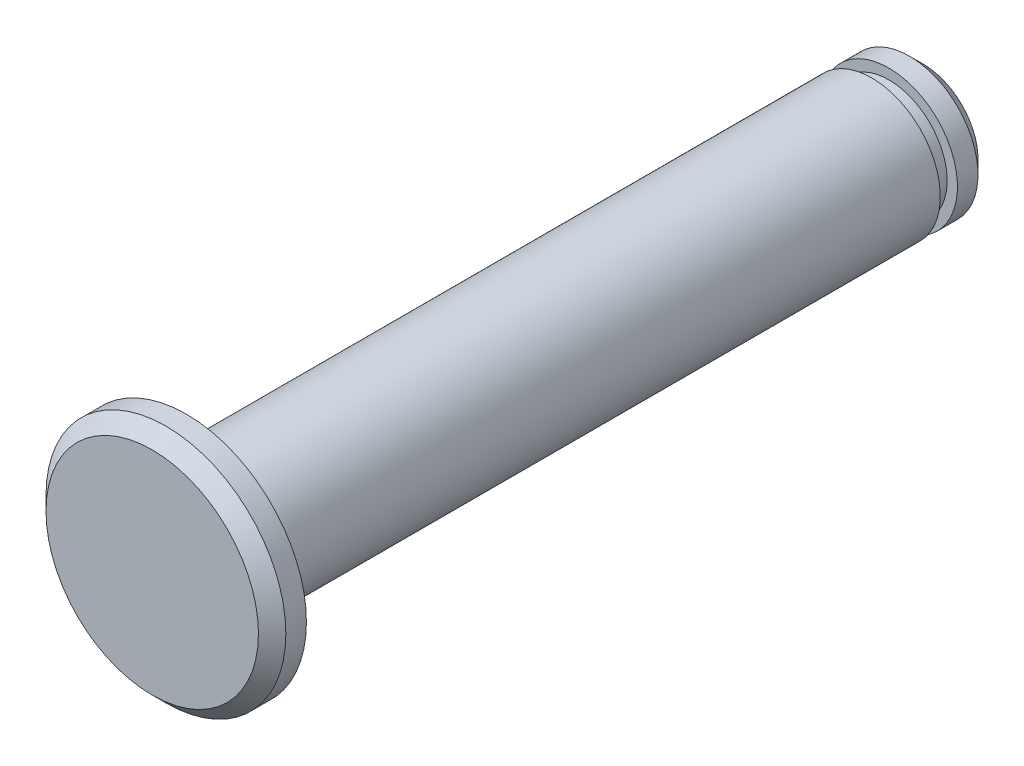
ISO-10303-21;
HEADER;
FILE_DESCRIPTION(('STEP AP214'),'2;1');
FILE_NAME('part.step','',(''),(''),'','','');
FILE_SCHEMA(('AUTOMOTIVE_DESIGN { 1 0 10303 214 1 1 1 1 }'));
ENDSEC;
DATA;
#1=APPLICATION_CONTEXT('core data for automotive mechanical design processes');
#2=APPLICATION_PROTOCOL_DEFINITION('international standard','automotive_design',2000,#1);
#3=PRODUCT_CONTEXT('',#1,'mechanical');
#4=PRODUCT('Part','Part','',(#3));
#5=PRODUCT_RELATED_PRODUCT_CATEGORY('part','',(#4));
#6=PRODUCT_DEFINITION_FORMATION('','',#4);
#7=PRODUCT_DEFINITION_CONTEXT('part definition',#1,'design');
#8=PRODUCT_DEFINITION('design','',#6,#7);
#9=PRODUCT_DEFINITION_SHAPE('','',#8);
#10=(LENGTH_UNIT() NAMED_UNIT(*) SI_UNIT(.MILLI.,.METRE.));
#11=(NAMED_UNIT(*) PLANE_ANGLE_UNIT() SI_UNIT($,.RADIAN.));
#12=(NAMED_UNIT(*) SI_UNIT($,.STERADIAN.) SOLID_ANGLE_UNIT());
#13=UNCERTAINTY_MEASURE_WITH_UNIT(LENGTH_MEASURE(1.E-05),#10,'distance_accuracy_value','');
#14=(GEOMETRIC_REPRESENTATION_CONTEXT(3) GLOBAL_UNCERTAINTY_ASSIGNED_CONTEXT((#13)) GLOBAL_UNIT_ASSIGNED_CONTEXT((#10,
#11,#12)) REPRESENTATION_CONTEXT('',''));
#15=CARTESIAN_POINT('',(0.,0.,0.));
#16=DIRECTION('',(0.,0.,1.));
#17=DIRECTION('',(1.,0.,0.));
#18=AXIS2_PLACEMENT_3D('',#15,#16,#17);
#19=CARTESIAN_POINT('',(0.,0.,-35.8966101694915));
#20=DIRECTION('',(0.,0.,-1.));
#21=DIRECTION('',(-1.,0.,0.));
#22=AXIS2_PLACEMENT_3D('',#19,#20,#21);
#23=PLANE('',#22);
#24=CARTESIAN_POINT('',(0.,0.,-35.8966101694915));
#25=DIRECTION('',(0.,0.,-1.));
#26=DIRECTION('',(-1.,0.,0.));
#27=AXIS2_PLACEMENT_3D('',#24,#25,#26);
#28=CIRCLE('',#27,3.19999999999997);
#29=CARTESIAN_POINT('',(-3.19999999999997,0.,-35.8966101694915));
#30=VERTEX_POINT('',#29);
#31=EDGE_CURVE('E44',#30,#30,#28,.T.);
#32=ORIENTED_EDGE('',*,*,#31,.T.);
#33=EDGE_LOOP('',(#32));
#34=FACE_BOUND('',#33,.T.);
#35=ADVANCED_FACE('F29',(#34),#23,.T.);
#36=CARTESIAN_POINT('',(0.,0.,9.10338983050848));
#37=DIRECTION('',(0.,0.,1.));
#38=DIRECTION('',(1.,0.,0.));
#39=AXIS2_PLACEMENT_3D('',#36,#37,#38);
#40=PLANE('',#39);
#41=CARTESIAN_POINT('',(0.,0.,9.10338983050848));
#42=DIRECTION('',(0.,0.,1.));
#43=DIRECTION('',(1.,0.,0.));
#44=AXIS2_PLACEMENT_3D('',#41,#42,#43);
#45=CIRCLE('',#44,6.19999999999999);
#46=CARTESIAN_POINT('',(6.19999999999999,0.,9.10338983050848));
#47=VERTEX_POINT('',#46);
#48=EDGE_CURVE('E10',#47,#47,#45,.T.);
#49=ORIENTED_EDGE('',*,*,#48,.T.);
#50=EDGE_LOOP('',(#49));
#51=FACE_BOUND('',#50,.T.);
#52=ADVANCED_FACE('F86',(#51),#40,.T.);
#53=CARTESIAN_POINT('',(0.,0.,-59.9245181233223));
#54=DIRECTION('',(0.,0.,-1.));
#55=DIRECTION('',(-1.,0.,0.));
#56=AXIS2_PLACEMENT_3D('',#53,#54,#55);
#57=CYLINDRICAL_SURFACE('',#56,6.99999999999999);
#58=CARTESIAN_POINT('',(0.,0.,8.3033898305085));
#59=DIRECTION('',(0.,0.,1.));
#60=DIRECTION('',(1.,0.,0.));
#61=AXIS2_PLACEMENT_3D('',#58,#59,#60);
#62=CIRCLE('',#61,6.99999999999999);
#63=CARTESIAN_POINT('',(6.99999999999999,0.,8.3033898305085));
#64=VERTEX_POINT('',#63);
#65=EDGE_CURVE('E36',#64,#64,#62,.F.);
#66=ORIENTED_EDGE('',*,*,#65,.T.);
#67=EDGE_LOOP('',(#66));
#68=FACE_BOUND('',#67,.T.);
#69=CARTESIAN_POINT('',(0.,0.,7.10338983050848));
#70=DIRECTION('',(0.,0.,-1.));
#71=DIRECTION('',(-1.,0.,0.));
#72=AXIS2_PLACEMENT_3D('',#69,#70,#71);
#73=CIRCLE('',#72,6.99999999999999);
#74=CARTESIAN_POINT('',(-6.99999999999999,0.,7.10338983050848));
#75=VERTEX_POINT('',#74);
#76=EDGE_CURVE('E49',#75,#75,#73,.T.);
#77=ORIENTED_EDGE('',*,*,#76,.F.);
#78=EDGE_LOOP('',(#77));
#79=FACE_BOUND('',#78,.T.);
#80=ADVANCED_FACE('F92',(#68,#79),#57,.T.);
#81=CARTESIAN_POINT('',(-6.99999999999999,0.,7.10338983050848));
#82=DIRECTION('',(0.,0.,-1.));
#83=DIRECTION('',(-1.,0.,0.));
#84=AXIS2_PLACEMENT_3D('',#81,#82,#83);
#85=PLANE('',#84);
#86=ORIENTED_EDGE('',*,*,#76,.T.);
#87=EDGE_LOOP('',(#86));
#88=FACE_BOUND('',#87,.T.);
#89=CARTESIAN_POINT('',(0.,0.,7.10338983050848));
#90=DIRECTION('',(0.,0.,-1.));
#91=DIRECTION('',(-1.,0.,0.));
#92=AXIS2_PLACEMENT_3D('',#89,#90,#91);
#93=CIRCLE('',#92,3.99999999999999);
#94=CARTESIAN_POINT('',(-3.99999999999999,0.,7.10338983050848));
#95=VERTEX_POINT('',#94);
#96=EDGE_CURVE('E52',#95,#95,#93,.T.);
#97=ORIENTED_EDGE('',*,*,#96,.F.);
#98=EDGE_LOOP('',(#97));
#99=FACE_BOUND('',#98,.T.);
#100=ADVANCED_FACE('F127',(#88,#99),#85,.T.);
#101=CARTESIAN_POINT('',(0.,0.,-59.9245181233223));
#102=DIRECTION('',(0.,0.,-1.));
#103=DIRECTION('',(-1.,0.,0.));
#104=AXIS2_PLACEMENT_3D('',#101,#102,#103);
#105=CYLINDRICAL_SURFACE('',#104,3.99999999999999);
#106=ORIENTED_EDGE('',*,*,#96,.T.);
#107=EDGE_LOOP('',(#106));
#108=FACE_BOUND('',#107,.T.);
#109=CARTESIAN_POINT('',(0.,0.,-32.8966101694915));
#110=DIRECTION('',(0.,0.,-1.));
#111=DIRECTION('',(-1.,0.,0.));
#112=AXIS2_PLACEMENT_3D('',#109,#110,#111);
#113=CIRCLE('',#112,3.99999999999999);
#114=CARTESIAN_POINT('',(-3.99999999999999,0.,-32.8966101694915));
#115=VERTEX_POINT('',#114);
#116=EDGE_CURVE('E55',#115,#115,#113,.T.);
#117=ORIENTED_EDGE('',*,*,#116,.F.);
#118=EDGE_LOOP('',(#117));
#119=FACE_BOUND('',#118,.T.);
#120=ADVANCED_FACE('F156',(#108,#119),#105,.T.);
#121=CARTESIAN_POINT('',(-3.99999999999999,0.,-32.8966101694915));
#122=DIRECTION('',(0.,0.,-1.));
#123=DIRECTION('',(-1.,0.,0.));
#124=AXIS2_PLACEMENT_3D('',#121,#122,#123);
#125=PLANE('',#124);
#126=ORIENTED_EDGE('',*,*,#116,.T.);
#127=EDGE_LOOP('',(#126));
#128=FACE_BOUND('',#127,.T.);
#129=CARTESIAN_POINT('',(0.,0.,-32.8966101694915));
#130=DIRECTION('',(0.,0.,-1.));
#131=DIRECTION('',(-1.,0.,0.));
#132=AXIS2_PLACEMENT_3D('',#129,#130,#131);
#133=CIRCLE('',#132,3.39999999999999);
#134=CARTESIAN_POINT('',(-3.39999999999999,0.,-32.8966101694915));
#135=VERTEX_POINT('',#134);
#136=EDGE_CURVE('E58',#135,#135,#133,.T.);
#137=ORIENTED_EDGE('',*,*,#136,.F.);
#138=EDGE_LOOP('',(#137));
#139=FACE_BOUND('',#138,.T.);
#140=ADVANCED_FACE('F82',(#128,#139),#125,.T.);
#141=CARTESIAN_POINT('',(0.,0.,-59.9245181233223));
#142=DIRECTION('',(0.,0.,-1.));
#143=DIRECTION('',(-1.,0.,0.));
#144=AXIS2_PLACEMENT_3D('',#141,#142,#143);
#145=CYLINDRICAL_SURFACE('',#144,3.39999999999999);
#146=ORIENTED_EDGE('',*,*,#136,.T.);
#147=EDGE_LOOP('',(#146));
#148=FACE_BOUND('',#147,.T.);
#149=CARTESIAN_POINT('',(0.,0.,-33.8966101694915));
#150=DIRECTION('',(0.,0.,-1.));
#151=DIRECTION('',(-1.,0.,0.));
#152=AXIS2_PLACEMENT_3D('',#149,#150,#151);
#153=CIRCLE('',#152,3.39999999999999);
#154=CARTESIAN_POINT('',(-3.39999999999999,0.,-33.8966101694915));
#155=VERTEX_POINT('',#154);
#156=EDGE_CURVE('E61',#155,#155,#153,.T.);
#157=ORIENTED_EDGE('',*,*,#156,.F.);
#158=EDGE_LOOP('',(#157));
#159=FACE_BOUND('',#158,.T.);
#160=ADVANCED_FACE('F72',(#148,#159),#145,.T.);
#161=CARTESIAN_POINT('',(-3.39999999999999,0.,-33.8966101694915));
#162=DIRECTION('',(0.,0.,1.));
#163=DIRECTION('',(1.,0.,0.));
#164=AXIS2_PLACEMENT_3D('',#161,#162,#163);
#165=PLANE('',#164);
#166=ORIENTED_EDGE('',*,*,#156,.T.);
#167=EDGE_LOOP('',(#166));
#168=FACE_BOUND('',#167,.T.);
#169=CARTESIAN_POINT('',(0.,0.,-33.8966101694915));
#170=DIRECTION('',(0.,0.,-1.));
#171=DIRECTION('',(-1.,0.,0.));
#172=AXIS2_PLACEMENT_3D('',#169,#170,#171);
#173=CIRCLE('',#172,3.99999999999998);
#174=CARTESIAN_POINT('',(-3.99999999999998,0.,-33.8966101694915));
#175=VERTEX_POINT('',#174);
#176=EDGE_CURVE('E64',#175,#175,#173,.T.);
#177=ORIENTED_EDGE('',*,*,#176,.F.);
#178=EDGE_LOOP('',(#177));
#179=FACE_BOUND('',#178,.T.);
#180=ADVANCED_FACE('F70',(#168,#179),#165,.T.);
#181=CARTESIAN_POINT('',(0.,0.,-59.9245181233223));
#182=DIRECTION('',(0.,0.,-1.));
#183=DIRECTION('',(-1.,0.,0.));
#184=AXIS2_PLACEMENT_3D('',#181,#182,#183);
#185=CYLINDRICAL_SURFACE('',#184,3.99999999999998);
#186=CARTESIAN_POINT('',(0.,0.,-35.0966101694915));
#187=DIRECTION('',(0.,0.,-1.));
#188=DIRECTION('',(-1.,0.,0.));
#189=AXIS2_PLACEMENT_3D('',#186,#187,#188);
#190=CIRCLE('',#189,3.99999999999998);
#191=CARTESIAN_POINT('',(-3.99999999999998,0.,-35.0966101694915));
#192=VERTEX_POINT('',#191);
#193=EDGE_CURVE('E40',#192,#192,#190,.F.);
#194=ORIENTED_EDGE('',*,*,#193,.T.);
#195=EDGE_LOOP('',(#194));
#196=FACE_BOUND('',#195,.T.);
#197=ORIENTED_EDGE('',*,*,#176,.T.);
#198=EDGE_LOOP('',(#197));
#199=FACE_BOUND('',#198,.T.);
#200=ADVANCED_FACE('F68',(#196,#199),#185,.T.);
#201=CARTESIAN_POINT('',(0.,0.,-35.8966101694915));
#202=DIRECTION('',(0.,0.,1.));
#203=DIRECTION('',(1.,0.,0.));
#204=AXIS2_PLACEMENT_3D('',#201,#202,#203);
#205=CONICAL_SURFACE('',#204,3.19999999999997,0.785398163397448);
#206=ORIENTED_EDGE('',*,*,#193,.F.);
#207=EDGE_LOOP('',(#206));
#208=FACE_BOUND('',#207,.T.);
#209=ORIENTED_EDGE('',*,*,#31,.F.);
#210=EDGE_LOOP('',(#209));
#211=FACE_BOUND('',#210,.T.);
#212=ADVANCED_FACE('F79',(#208,#211),#205,.T.);
#213=CARTESIAN_POINT('',(0.,0.,8.3033898305085));
#214=DIRECTION('',(0.,0.,-1.));
#215=DIRECTION('',(-1.,0.,0.));
#216=AXIS2_PLACEMENT_3D('',#213,#214,#215);
#217=CONICAL_SURFACE('',#216,6.99999999999999,0.785398163397457);
#218=ORIENTED_EDGE('',*,*,#48,.F.);
#219=EDGE_LOOP('',(#218));
#220=FACE_BOUND('',#219,.T.);
#221=ORIENTED_EDGE('',*,*,#65,.F.);
#222=EDGE_LOOP('',(#221));
#223=FACE_BOUND('',#222,.T.);
#224=ADVANCED_FACE('F31',(#220,#223),#217,.T.);
#225=CLOSED_SHELL('',(#35,#52,#80,#100,#120,#140,#160,#180,#200,#212,#224));
#226=MANIFOLD_SOLID_BREP('B2',#225);
#227=ADVANCED_BREP_SHAPE_REPRESENTATION('',(#18,#226),#14);
#228=SHAPE_DEFINITION_REPRESENTATION(#9,#227);
ENDSEC;
END-ISO-10303-21;
